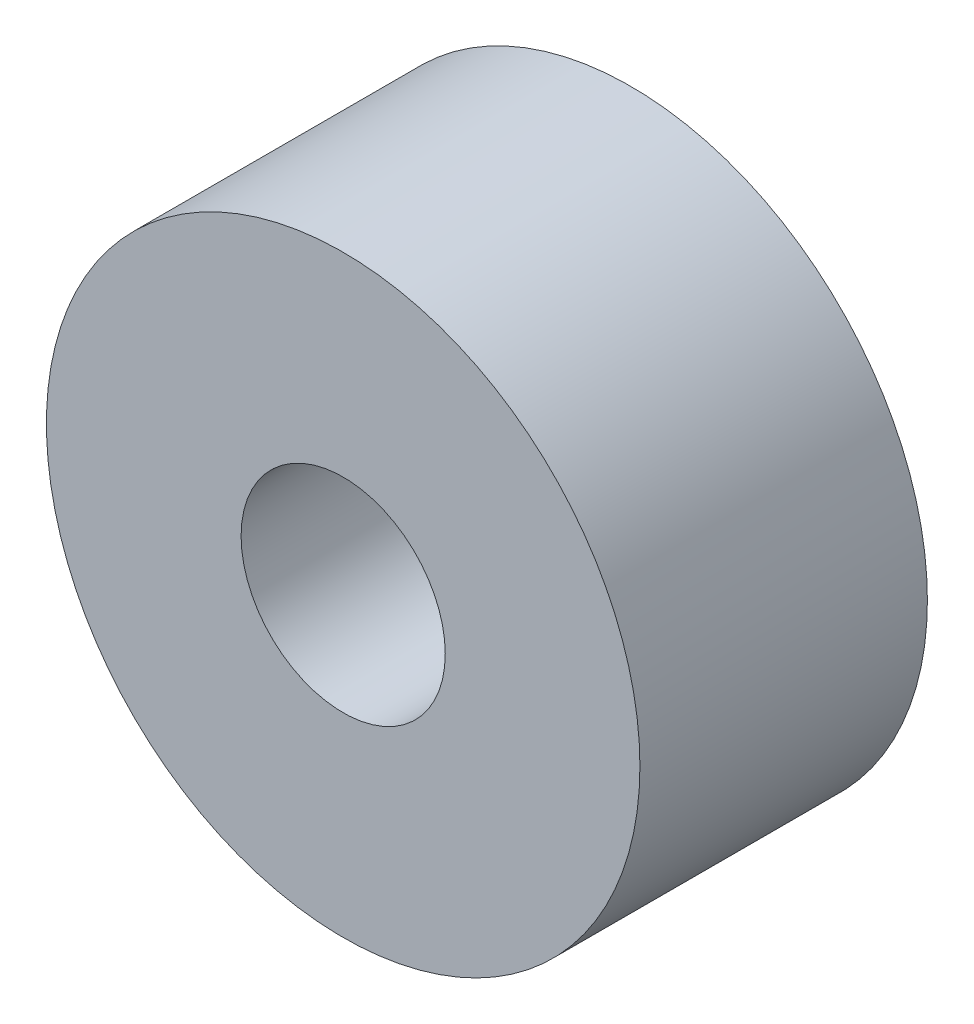
ISO-10303-21;
HEADER;
FILE_DESCRIPTION(('STEP AP214'),'2;1');
FILE_NAME('part.step','',(''),(''),'','','');
FILE_SCHEMA(('AUTOMOTIVE_DESIGN { 1 0 10303 214 1 1 1 1 }'));
ENDSEC;
DATA;
#1=APPLICATION_CONTEXT('core data for automotive mechanical design processes');
#2=APPLICATION_PROTOCOL_DEFINITION('international standard','automotive_design',2000,#1);
#3=PRODUCT_CONTEXT('',#1,'mechanical');
#4=PRODUCT('Part','Part','',(#3));
#5=PRODUCT_RELATED_PRODUCT_CATEGORY('part','',(#4));
#6=PRODUCT_DEFINITION_FORMATION('','',#4);
#7=PRODUCT_DEFINITION_CONTEXT('part definition',#1,'design');
#8=PRODUCT_DEFINITION('design','',#6,#7);
#9=PRODUCT_DEFINITION_SHAPE('','',#8);
#10=(LENGTH_UNIT() NAMED_UNIT(*) SI_UNIT(.MILLI.,.METRE.));
#11=(NAMED_UNIT(*) PLANE_ANGLE_UNIT() SI_UNIT($,.RADIAN.));
#12=(NAMED_UNIT(*) SI_UNIT($,.STERADIAN.) SOLID_ANGLE_UNIT());
#13=UNCERTAINTY_MEASURE_WITH_UNIT(LENGTH_MEASURE(1.E-05),#10,'distance_accuracy_value','');
#14=(GEOMETRIC_REPRESENTATION_CONTEXT(3) GLOBAL_UNCERTAINTY_ASSIGNED_CONTEXT((#13)) GLOBAL_UNIT_ASSIGNED_CONTEXT((#10,
#11,#12)) REPRESENTATION_CONTEXT('',''));
#15=CARTESIAN_POINT('',(0.,0.,0.));
#16=DIRECTION('',(0.,0.,1.));
#17=DIRECTION('',(1.,0.,0.));
#18=AXIS2_PLACEMENT_3D('',#15,#16,#17);
#19=CARTESIAN_POINT('',(0.,0.,0.));
#20=DIRECTION('',(0.,0.,1.));
#21=DIRECTION('',(1.,0.,0.));
#22=AXIS2_PLACEMENT_3D('',#19,#20,#21);
#23=CYLINDRICAL_SURFACE('',#22,17.4752);
#24=CARTESIAN_POINT('',(0.,0.,24.60625));
#25=DIRECTION('',(0.,0.,1.));
#26=DIRECTION('',(1.,0.,0.));
#27=AXIS2_PLACEMENT_3D('',#24,#25,#26);
#28=CIRCLE('',#27,17.4752);
#29=CARTESIAN_POINT('',(17.4752,0.,24.60625));
#30=VERTEX_POINT('',#29);
#31=EDGE_CURVE('E26',#30,#30,#28,.F.);
#32=ORIENTED_EDGE('',*,*,#31,.F.);
#33=EDGE_LOOP('',(#32));
#34=FACE_BOUND('',#33,.T.);
#35=CARTESIAN_POINT('',(0.,0.,-24.60625));
#36=DIRECTION('',(0.,0.,1.));
#37=DIRECTION('',(1.,0.,0.));
#38=AXIS2_PLACEMENT_3D('',#35,#36,#37);
#39=CIRCLE('',#38,17.4752);
#40=CARTESIAN_POINT('',(17.4752,0.,-24.60625));
#41=VERTEX_POINT('',#40);
#42=EDGE_CURVE('E17',#41,#41,#39,.F.);
#43=ORIENTED_EDGE('',*,*,#42,.T.);
#44=EDGE_LOOP('',(#43));
#45=FACE_BOUND('',#44,.T.);
#46=ADVANCED_FACE('F14',(#34,#45),#23,.F.);
#47=CARTESIAN_POINT('',(0.,0.,-24.60625));
#48=DIRECTION('',(0.,0.,1.));
#49=DIRECTION('',(1.,0.,0.));
#50=AXIS2_PLACEMENT_3D('',#47,#48,#49);
#51=PLANE('',#50);
#52=ORIENTED_EDGE('',*,*,#42,.F.);
#53=EDGE_LOOP('',(#52));
#54=FACE_BOUND('',#53,.T.);
#55=CARTESIAN_POINT('',(0.,0.,-24.60625));
#56=DIRECTION('',(0.,0.,1.));
#57=DIRECTION('',(1.,0.,0.));
#58=AXIS2_PLACEMENT_3D('',#55,#56,#57);
#59=CIRCLE('',#58,50.8);
#60=CARTESIAN_POINT('',(50.8,0.,-24.60625));
#61=VERTEX_POINT('',#60);
#62=EDGE_CURVE('E21',#61,#61,#59,.T.);
#63=ORIENTED_EDGE('',*,*,#62,.F.);
#64=EDGE_LOOP('',(#63));
#65=FACE_BOUND('',#64,.T.);
#66=ADVANCED_FACE('F35',(#54,#65),#51,.F.);
#67=CARTESIAN_POINT('',(0.,0.,24.60625));
#68=DIRECTION('',(0.,0.,1.));
#69=DIRECTION('',(1.,0.,0.));
#70=AXIS2_PLACEMENT_3D('',#67,#68,#69);
#71=PLANE('',#70);
#72=ORIENTED_EDGE('',*,*,#31,.T.);
#73=EDGE_LOOP('',(#72));
#74=FACE_BOUND('',#73,.T.);
#75=CARTESIAN_POINT('',(0.,0.,24.60625));
#76=DIRECTION('',(0.,0.,1.));
#77=DIRECTION('',(1.,0.,0.));
#78=AXIS2_PLACEMENT_3D('',#75,#76,#77);
#79=CIRCLE('',#78,50.8);
#80=CARTESIAN_POINT('',(50.8,0.,24.60625));
#81=VERTEX_POINT('',#80);
#82=EDGE_CURVE('E10',#81,#81,#79,.F.);
#83=ORIENTED_EDGE('',*,*,#82,.F.);
#84=EDGE_LOOP('',(#83));
#85=FACE_BOUND('',#84,.T.);
#86=ADVANCED_FACE('F38',(#74,#85),#71,.T.);
#87=CARTESIAN_POINT('',(0.,0.,0.));
#88=DIRECTION('',(0.,0.,1.));
#89=DIRECTION('',(1.,0.,0.));
#90=AXIS2_PLACEMENT_3D('',#87,#88,#89);
#91=CYLINDRICAL_SURFACE('',#90,50.8);
#92=ORIENTED_EDGE('',*,*,#82,.T.);
#93=EDGE_LOOP('',(#92));
#94=FACE_BOUND('',#93,.T.);
#95=ORIENTED_EDGE('',*,*,#62,.T.);
#96=EDGE_LOOP('',(#95));
#97=FACE_BOUND('',#96,.T.);
#98=ADVANCED_FACE('F41',(#94,#97),#91,.T.);
#99=CLOSED_SHELL('',(#46,#66,#86,#98));
#100=MANIFOLD_SOLID_BREP('B1',#99);
#101=ADVANCED_BREP_SHAPE_REPRESENTATION('',(#18,#100),#14);
#102=SHAPE_DEFINITION_REPRESENTATION(#9,#101);
ENDSEC;
END-ISO-10303-21;
